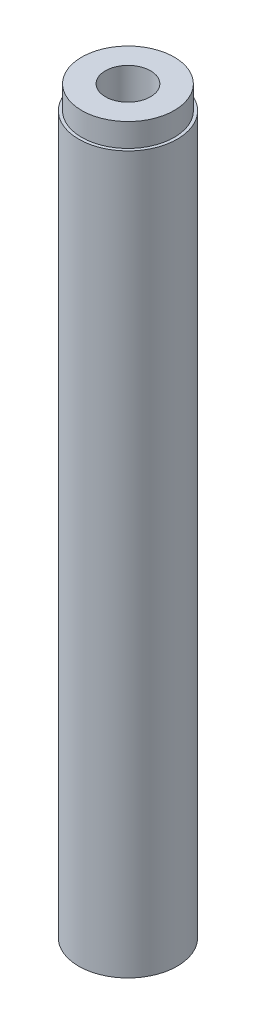
ISO-10303-21;
HEADER;
FILE_DESCRIPTION(('STEP AP214'),'2;1');
FILE_NAME('part.step','',(''),(''),'','','');
FILE_SCHEMA(('AUTOMOTIVE_DESIGN { 1 0 10303 214 1 1 1 1 }'));
ENDSEC;
DATA;
#1=APPLICATION_CONTEXT('core data for automotive mechanical design processes');
#2=APPLICATION_PROTOCOL_DEFINITION('international standard','automotive_design',2000,#1);
#3=PRODUCT_CONTEXT('',#1,'mechanical');
#4=PRODUCT('Part','Part','',(#3));
#5=PRODUCT_RELATED_PRODUCT_CATEGORY('part','',(#4));
#6=PRODUCT_DEFINITION_FORMATION('','',#4);
#7=PRODUCT_DEFINITION_CONTEXT('part definition',#1,'design');
#8=PRODUCT_DEFINITION('design','',#6,#7);
#9=PRODUCT_DEFINITION_SHAPE('','',#8);
#10=(LENGTH_UNIT() NAMED_UNIT(*) SI_UNIT(.MILLI.,.METRE.));
#11=(NAMED_UNIT(*) PLANE_ANGLE_UNIT() SI_UNIT($,.RADIAN.));
#12=(NAMED_UNIT(*) SI_UNIT($,.STERADIAN.) SOLID_ANGLE_UNIT());
#13=UNCERTAINTY_MEASURE_WITH_UNIT(LENGTH_MEASURE(1.E-05),#10,'distance_accuracy_value','');
#14=(GEOMETRIC_REPRESENTATION_CONTEXT(3) GLOBAL_UNCERTAINTY_ASSIGNED_CONTEXT((#13)) GLOBAL_UNIT_ASSIGNED_CONTEXT((#10,
#11,#12)) REPRESENTATION_CONTEXT('',''));
#15=CARTESIAN_POINT('',(0.,0.,0.));
#16=DIRECTION('',(0.,0.,1.));
#17=DIRECTION('',(1.,0.,0.));
#18=AXIS2_PLACEMENT_3D('',#15,#16,#17);
#19=CARTESIAN_POINT('',(0.,98.3,0.));
#20=DIRECTION('',(0.,1.,0.));
#21=DIRECTION('',(0.,0.,1.));
#22=AXIS2_PLACEMENT_3D('',#19,#20,#21);
#23=PLANE('',#22);
#24=CARTESIAN_POINT('',(0.,98.3,0.));
#25=DIRECTION('',(0.,1.,0.));
#26=DIRECTION('',(0.,0.,1.));
#27=AXIS2_PLACEMENT_3D('',#24,#25,#26);
#28=CIRCLE('',#27,3.);
#29=CARTESIAN_POINT('',(0.,98.3,3.));
#30=VERTEX_POINT('',#29);
#31=EDGE_CURVE('E44',#30,#30,#28,.T.);
#32=ORIENTED_EDGE('',*,*,#31,.F.);
#33=EDGE_LOOP('',(#32));
#34=FACE_BOUND('',#33,.T.);
#35=CARTESIAN_POINT('',(0.,98.3,0.));
#36=DIRECTION('',(0.,1.,0.));
#37=DIRECTION('',(0.,0.,1.));
#38=AXIS2_PLACEMENT_3D('',#35,#36,#37);
#39=CIRCLE('',#38,6.15);
#40=CARTESIAN_POINT('',(0.,98.3,6.15));
#41=VERTEX_POINT('',#40);
#42=EDGE_CURVE('E58',#41,#41,#39,.T.);
#43=ORIENTED_EDGE('',*,*,#42,.T.);
#44=EDGE_LOOP('',(#43));
#45=FACE_BOUND('',#44,.T.);
#46=ADVANCED_FACE('F37',(#34,#45),#23,.T.);
#47=CARTESIAN_POINT('',(0.,98.3,0.));
#48=DIRECTION('',(0.,-1.,0.));
#49=DIRECTION('',(0.,0.,-1.));
#50=AXIS2_PLACEMENT_3D('',#47,#48,#49);
#51=CYLINDRICAL_SURFACE('',#50,6.55);
#52=CARTESIAN_POINT('',(0.,0.,0.));
#53=DIRECTION('',(0.,1.,0.));
#54=DIRECTION('',(0.,0.,1.));
#55=AXIS2_PLACEMENT_3D('',#52,#53,#54);
#56=CIRCLE('',#55,6.55);
#57=CARTESIAN_POINT('',(0.,0.,6.55));
#58=VERTEX_POINT('',#57);
#59=EDGE_CURVE('E11',#58,#58,#56,.T.);
#60=ORIENTED_EDGE('',*,*,#59,.T.);
#61=EDGE_LOOP('',(#60));
#62=FACE_BOUND('',#61,.T.);
#63=CARTESIAN_POINT('',(0.,95.2,0.));
#64=DIRECTION('',(0.,1.,0.));
#65=DIRECTION('',(0.,0.,1.));
#66=AXIS2_PLACEMENT_3D('',#63,#64,#65);
#67=CIRCLE('',#66,6.55);
#68=CARTESIAN_POINT('',(0.,95.2,6.55));
#69=VERTEX_POINT('',#68);
#70=EDGE_CURVE('E53',#69,#69,#67,.T.);
#71=ORIENTED_EDGE('',*,*,#70,.F.);
#72=EDGE_LOOP('',(#71));
#73=FACE_BOUND('',#72,.T.);
#74=ADVANCED_FACE('F39',(#62,#73),#51,.T.);
#75=CARTESIAN_POINT('',(0.,0.,0.));
#76=DIRECTION('',(0.,1.,0.));
#77=DIRECTION('',(0.,0.,1.));
#78=AXIS2_PLACEMENT_3D('',#75,#76,#77);
#79=PLANE('',#78);
#80=ORIENTED_EDGE('',*,*,#59,.F.);
#81=EDGE_LOOP('',(#80));
#82=FACE_BOUND('',#81,.T.);
#83=CARTESIAN_POINT('',(0.,0.,0.));
#84=DIRECTION('',(0.,1.,0.));
#85=DIRECTION('',(0.,0.,1.));
#86=AXIS2_PLACEMENT_3D('',#83,#84,#85);
#87=CIRCLE('',#86,3.);
#88=CARTESIAN_POINT('',(0.,0.,3.));
#89=VERTEX_POINT('',#88);
#90=EDGE_CURVE('E48',#89,#89,#87,.T.);
#91=ORIENTED_EDGE('',*,*,#90,.T.);
#92=EDGE_LOOP('',(#91));
#93=FACE_BOUND('',#92,.T.);
#94=ADVANCED_FACE('F75',(#82,#93),#79,.F.);
#95=CARTESIAN_POINT('',(0.,98.3,0.));
#96=DIRECTION('',(0.,-1.,0.));
#97=DIRECTION('',(0.,0.,-1.));
#98=AXIS2_PLACEMENT_3D('',#95,#96,#97);
#99=CYLINDRICAL_SURFACE('',#98,3.);
#100=ORIENTED_EDGE('',*,*,#31,.T.);
#101=EDGE_LOOP('',(#100));
#102=FACE_BOUND('',#101,.T.);
#103=ORIENTED_EDGE('',*,*,#90,.F.);
#104=EDGE_LOOP('',(#103));
#105=FACE_BOUND('',#104,.T.);
#106=ADVANCED_FACE('F70',(#102,#105),#99,.F.);
#107=CARTESIAN_POINT('',(0.,95.2,0.));
#108=DIRECTION('',(0.,1.,0.));
#109=DIRECTION('',(0.,0.,1.));
#110=AXIS2_PLACEMENT_3D('',#107,#108,#109);
#111=PLANE('',#110);
#112=CARTESIAN_POINT('',(0.,95.2,0.));
#113=DIRECTION('',(0.,1.,0.));
#114=DIRECTION('',(0.,0.,1.));
#115=AXIS2_PLACEMENT_3D('',#112,#113,#114);
#116=CIRCLE('',#115,6.15);
#117=CARTESIAN_POINT('',(0.,95.2,6.15));
#118=VERTEX_POINT('',#117);
#119=EDGE_CURVE('E57',#118,#118,#116,.T.);
#120=ORIENTED_EDGE('',*,*,#119,.F.);
#121=EDGE_LOOP('',(#120));
#122=FACE_BOUND('',#121,.T.);
#123=ORIENTED_EDGE('',*,*,#70,.T.);
#124=EDGE_LOOP('',(#123));
#125=FACE_BOUND('',#124,.T.);
#126=ADVANCED_FACE('F67',(#122,#125),#111,.T.);
#127=CARTESIAN_POINT('',(0.,95.2,0.));
#128=DIRECTION('',(0.,1.,0.));
#129=DIRECTION('',(0.,0.,1.));
#130=AXIS2_PLACEMENT_3D('',#127,#128,#129);
#131=CYLINDRICAL_SURFACE('',#130,6.15);
#132=CARTESIAN_POINT('',(0.,95.2,6.15));
#133=CARTESIAN_POINT('',(0.,95.2322916666667,6.15));
#134=CARTESIAN_POINT('',(0.,95.2645833333333,6.15));
#135=CARTESIAN_POINT('',(0.,95.3291666666667,6.15));
#136=CARTESIAN_POINT('',(0.,95.3614583333333,6.15));
#137=CARTESIAN_POINT('',(0.,95.4260416666666,6.15));
#138=CARTESIAN_POINT('',(0.,95.4583333333333,6.15));
#139=CARTESIAN_POINT('',(0.,95.5229166666666,6.15));
#140=CARTESIAN_POINT('',(0.,95.5552083333333,6.15));
#141=CARTESIAN_POINT('',(0.,95.6197916666667,6.15));
#142=CARTESIAN_POINT('',(0.,95.6520833333333,6.15));
#143=CARTESIAN_POINT('',(0.,95.7166666666667,6.15));
#144=CARTESIAN_POINT('',(0.,95.7489583333333,6.15));
#145=CARTESIAN_POINT('',(0.,95.8135416666667,6.15));
#146=CARTESIAN_POINT('',(0.,95.8458333333333,6.15));
#147=CARTESIAN_POINT('',(0.,95.9104166666666,6.15));
#148=CARTESIAN_POINT('',(0.,95.9427083333333,6.15));
#149=CARTESIAN_POINT('',(0.,96.0072916666667,6.15));
#150=CARTESIAN_POINT('',(0.,96.0395833333333,6.15));
#151=CARTESIAN_POINT('',(0.,96.1041666666667,6.15));
#152=CARTESIAN_POINT('',(0.,96.1364583333333,6.15));
#153=CARTESIAN_POINT('',(0.,96.2010416666667,6.15));
#154=CARTESIAN_POINT('',(0.,96.2333333333333,6.15));
#155=CARTESIAN_POINT('',(0.,96.2979166666667,6.15));
#156=CARTESIAN_POINT('',(0.,96.3302083333333,6.15));
#157=CARTESIAN_POINT('',(0.,96.3947916666667,6.15));
#158=CARTESIAN_POINT('',(0.,96.4270833333333,6.15));
#159=CARTESIAN_POINT('',(0.,96.4916666666667,6.15));
#160=CARTESIAN_POINT('',(0.,96.5239583333333,6.15));
#161=CARTESIAN_POINT('',(0.,96.5885416666667,6.15));
#162=CARTESIAN_POINT('',(0.,96.6208333333333,6.15));
#163=CARTESIAN_POINT('',(0.,96.6854166666667,6.15));
#164=CARTESIAN_POINT('',(0.,96.7177083333333,6.15));
#165=CARTESIAN_POINT('',(0.,96.7822916666667,6.15));
#166=CARTESIAN_POINT('',(0.,96.8145833333333,6.15));
#167=CARTESIAN_POINT('',(0.,96.8791666666666,6.15));
#168=CARTESIAN_POINT('',(0.,96.9114583333333,6.15));
#169=CARTESIAN_POINT('',(0.,96.9760416666667,6.15));
#170=CARTESIAN_POINT('',(0.,97.0083333333333,6.15));
#171=CARTESIAN_POINT('',(0.,97.0729166666667,6.15));
#172=CARTESIAN_POINT('',(0.,97.1052083333333,6.15));
#173=CARTESIAN_POINT('',(0.,97.1697916666667,6.15));
#174=CARTESIAN_POINT('',(0.,97.2020833333333,6.15));
#175=CARTESIAN_POINT('',(0.,97.2666666666667,6.15));
#176=CARTESIAN_POINT('',(0.,97.2989583333333,6.15));
#177=CARTESIAN_POINT('',(0.,97.3635416666667,6.15));
#178=CARTESIAN_POINT('',(0.,97.3958333333333,6.15));
#179=CARTESIAN_POINT('',(0.,97.4604166666667,6.15));
#180=CARTESIAN_POINT('',(0.,97.4927083333333,6.15));
#181=CARTESIAN_POINT('',(0.,97.5572916666667,6.15));
#182=CARTESIAN_POINT('',(0.,97.5895833333333,6.15));
#183=CARTESIAN_POINT('',(0.,97.6541666666667,6.15));
#184=CARTESIAN_POINT('',(0.,97.6864583333333,6.15));
#185=CARTESIAN_POINT('',(0.,97.7510416666667,6.15));
#186=CARTESIAN_POINT('',(0.,97.7833333333333,6.15));
#187=CARTESIAN_POINT('',(0.,97.8479166666667,6.15));
#188=CARTESIAN_POINT('',(0.,97.8802083333333,6.15));
#189=CARTESIAN_POINT('',(0.,97.9447916666667,6.15));
#190=CARTESIAN_POINT('',(0.,97.9770833333333,6.15));
#191=CARTESIAN_POINT('',(0.,98.0416666666667,6.15));
#192=CARTESIAN_POINT('',(0.,98.0739583333333,6.15));
#193=CARTESIAN_POINT('',(0.,98.1385416666667,6.15));
#194=CARTESIAN_POINT('',(0.,98.1708333333333,6.15));
#195=CARTESIAN_POINT('',(0.,98.2354166666667,6.15));
#196=CARTESIAN_POINT('',(0.,98.2677083333333,6.15));
#197=CARTESIAN_POINT('',(0.,98.3,6.15));
#198=B_SPLINE_CURVE_WITH_KNOTS('',3,(#132,#133,#134,#135,#136,#137,#138,#139,#140,#141,#142,
#143,#144,#145,#146,#147,#148,#149,#150,#151,#152,#153,#154,#155,#156,#157,#158,#159,#160,#161,
#162,#163,#164,#165,#166,#167,#168,#169,#170,#171,#172,#173,#174,#175,#176,#177,#178,#179,#180,
#181,#182,#183,#184,#185,#186,#187,#188,#189,#190,#191,#192,#193,#194,#195,#196,#197),
.UNSPECIFIED.,.F.,.F.,(4,2,2,2,2,2,2,2,2,2,2,2,2,2,2,2,2,2,2,2,2,2,2,2,2,2,2,2,2,2,2,2,4),(0.,
0.0968749999999963,0.193749999999993,0.290624999999989,0.387499999999999,0.484374999999995,
0.581249999999991,0.678124999999988,0.774999999999998,0.871874999999994,0.96874999999999,
1.065625,1.1625,1.25937499999999,1.35624999999999,1.453125,1.55,1.64687499999999,1.74375,
1.840625,1.93749999999999,2.03437499999999,2.13125,2.228125,2.32499999999999,2.421875,2.51875,
2.615625,2.71249999999999,2.809375,2.90625,3.003125,3.09999999999999),.UNSPECIFIED.);
#199=EDGE_CURVE('BSEAM64',#118,#41,#198,.T.);
#200=ORIENTED_EDGE('',*,*,#119,.T.);
#201=ORIENTED_EDGE('',*,*,#42,.F.);
#202=ORIENTED_EDGE('',*,*,#199,.T.);
#203=ORIENTED_EDGE('',*,*,#199,.F.);
#204=EDGE_LOOP('',(#200,#202,#201,#203));
#205=FACE_BOUND('',#204,.T.);
#206=ADVANCED_FACE('F64',(#205),#131,.T.);
#207=CLOSED_SHELL('',(#46,#74,#94,#106,#126,#206));
#208=MANIFOLD_SOLID_BREP('B2',#207);
#209=ADVANCED_BREP_SHAPE_REPRESENTATION('',(#18,#208),#14);
#210=SHAPE_DEFINITION_REPRESENTATION(#9,#209);
ENDSEC;
END-ISO-10303-21;
